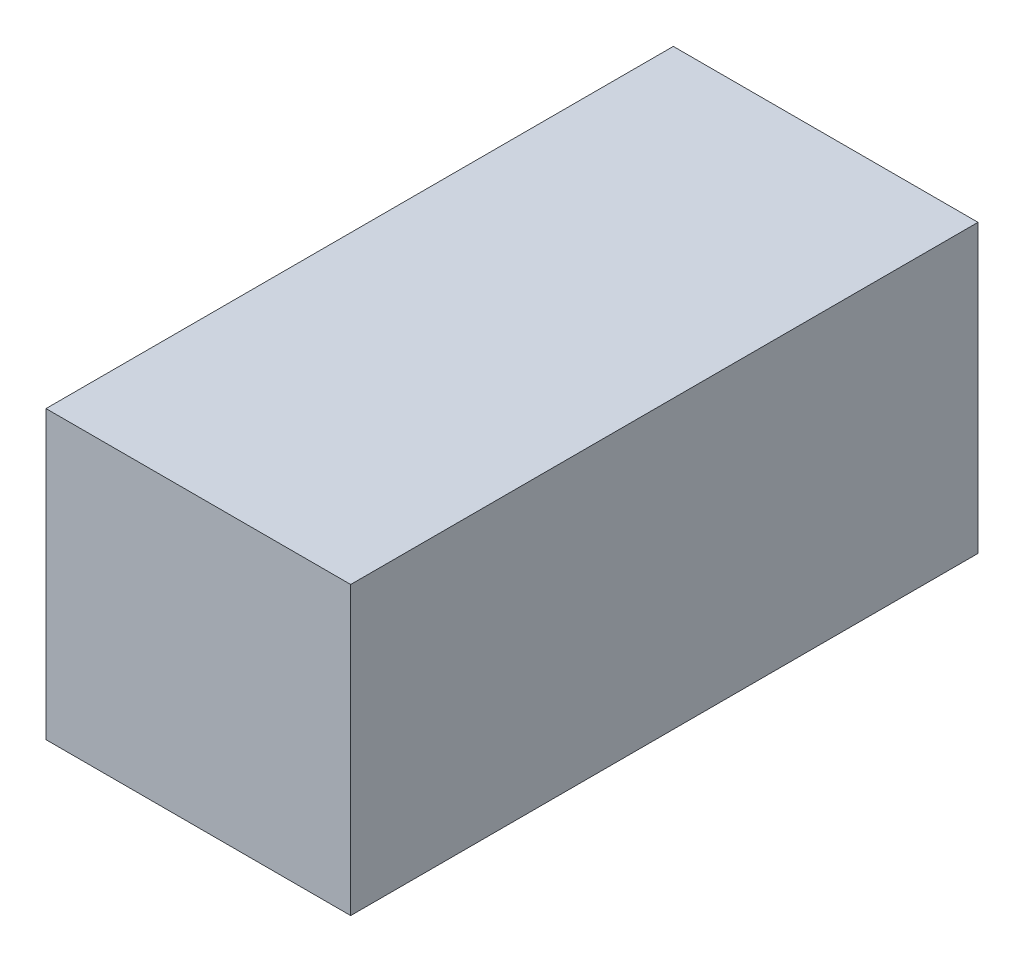
ISO-10303-21;
HEADER;
FILE_DESCRIPTION(('STEP AP214'),'2;1');
FILE_NAME('part.step','',(''),(''),'','','');
FILE_SCHEMA(('AUTOMOTIVE_DESIGN { 1 0 10303 214 1 1 1 1 }'));
ENDSEC;
DATA;
#1=APPLICATION_CONTEXT('core data for automotive mechanical design processes');
#2=APPLICATION_PROTOCOL_DEFINITION('international standard','automotive_design',2000,#1);
#3=PRODUCT_CONTEXT('',#1,'mechanical');
#4=PRODUCT('Part','Part','',(#3));
#5=PRODUCT_RELATED_PRODUCT_CATEGORY('part','',(#4));
#6=PRODUCT_DEFINITION_FORMATION('','',#4);
#7=PRODUCT_DEFINITION_CONTEXT('part definition',#1,'design');
#8=PRODUCT_DEFINITION('design','',#6,#7);
#9=PRODUCT_DEFINITION_SHAPE('','',#8);
#10=(LENGTH_UNIT() NAMED_UNIT(*) SI_UNIT(.MILLI.,.METRE.));
#11=(NAMED_UNIT(*) PLANE_ANGLE_UNIT() SI_UNIT($,.RADIAN.));
#12=(NAMED_UNIT(*) SI_UNIT($,.STERADIAN.) SOLID_ANGLE_UNIT());
#13=UNCERTAINTY_MEASURE_WITH_UNIT(LENGTH_MEASURE(1.E-05),#10,'distance_accuracy_value','');
#14=(GEOMETRIC_REPRESENTATION_CONTEXT(3) GLOBAL_UNCERTAINTY_ASSIGNED_CONTEXT((#13)) GLOBAL_UNIT_ASSIGNED_CONTEXT((#10,
#11,#12)) REPRESENTATION_CONTEXT('',''));
#15=CARTESIAN_POINT('',(0.,0.,0.));
#16=DIRECTION('',(0.,0.,1.));
#17=DIRECTION('',(1.,0.,0.));
#18=AXIS2_PLACEMENT_3D('',#15,#16,#17);
#19=CARTESIAN_POINT('',(14.8470188679246,8.128,-11.2383018867924));
#20=DIRECTION('',(1.,0.,0.));
#21=DIRECTION('',(0.,0.,-1.));
#22=AXIS2_PLACEMENT_3D('',#19,#20,#21);
#23=PLANE('',#22);
#24=DIRECTION('',(0.,0.,1.));
#25=VECTOR('',#24,1.);
#26=CARTESIAN_POINT('',(14.8470188679246,0.,-11.2383018867924));
#27=LINE('',#26,#25);
#28=CARTESIAN_POINT('',(14.8470188679246,0.,-11.2383018867924));
#29=VERTEX_POINT('',#28);
#30=CARTESIAN_POINT('',(14.8470188679246,0.,6.54169811320755));
#31=VERTEX_POINT('',#30);
#32=EDGE_CURVE('E104',#29,#31,#27,.T.);
#33=ORIENTED_EDGE('',*,*,#32,.T.);
#34=DIRECTION('',(0.,-1.,0.));
#35=VECTOR('',#34,1.);
#36=CARTESIAN_POINT('',(14.8470188679246,8.128,6.54169811320755));
#37=LINE('',#36,#35);
#38=CARTESIAN_POINT('',(14.8470188679246,8.128,6.54169811320755));
#39=VERTEX_POINT('',#38);
#40=EDGE_CURVE('E11',#39,#31,#37,.T.);
#41=ORIENTED_EDGE('',*,*,#40,.F.);
#42=DIRECTION('',(0.,0.,1.));
#43=VECTOR('',#42,1.);
#44=CARTESIAN_POINT('',(14.8470188679246,8.128,-11.2383018867924));
#45=LINE('',#44,#43);
#46=CARTESIAN_POINT('',(14.8470188679246,8.128,-11.2383018867924));
#47=VERTEX_POINT('',#46);
#48=EDGE_CURVE('E92',#47,#39,#45,.T.);
#49=ORIENTED_EDGE('',*,*,#48,.F.);
#50=DIRECTION('',(0.,-1.,0.));
#51=VECTOR('',#50,1.);
#52=CARTESIAN_POINT('',(14.8470188679246,8.128,-11.2383018867924));
#53=LINE('',#52,#51);
#54=EDGE_CURVE('E100',#47,#29,#53,.T.);
#55=ORIENTED_EDGE('',*,*,#54,.T.);
#56=EDGE_LOOP('',(#33,#41,#49,#55));
#57=FACE_BOUND('',#56,.T.);
#58=ADVANCED_FACE('F41',(#57),#23,.F.);
#59=CARTESIAN_POINT('',(14.8470188679246,8.128,6.54169811320755));
#60=DIRECTION('',(0.,0.,-1.));
#61=DIRECTION('',(-1.,0.,0.));
#62=AXIS2_PLACEMENT_3D('',#59,#60,#61);
#63=PLANE('',#62);
#64=DIRECTION('',(1.,0.,0.));
#65=VECTOR('',#64,1.);
#66=CARTESIAN_POINT('',(14.8470188679246,0.,6.54169811320755));
#67=LINE('',#66,#65);
#68=CARTESIAN_POINT('',(23.4830188679245,0.,6.54169811320756));
#69=VERTEX_POINT('',#68);
#70=EDGE_CURVE('E96',#31,#69,#67,.T.);
#71=ORIENTED_EDGE('',*,*,#70,.T.);
#72=DIRECTION('',(0.,-1.,0.));
#73=VECTOR('',#72,1.);
#74=CARTESIAN_POINT('',(23.4830188679245,8.128,6.54169811320756));
#75=LINE('',#74,#73);
#76=CARTESIAN_POINT('',(23.4830188679245,8.128,6.54169811320756));
#77=VERTEX_POINT('',#76);
#78=EDGE_CURVE('E49',#77,#69,#75,.T.);
#79=ORIENTED_EDGE('',*,*,#78,.F.);
#80=DIRECTION('',(1.,0.,0.));
#81=VECTOR('',#80,1.);
#82=CARTESIAN_POINT('',(14.8470188679246,8.128,6.54169811320755));
#83=LINE('',#82,#81);
#84=EDGE_CURVE('E87',#39,#77,#83,.T.);
#85=ORIENTED_EDGE('',*,*,#84,.F.);
#86=ORIENTED_EDGE('',*,*,#40,.T.);
#87=EDGE_LOOP('',(#71,#79,#85,#86));
#88=FACE_BOUND('',#87,.T.);
#89=ADVANCED_FACE('F95',(#88),#63,.F.);
#90=CARTESIAN_POINT('',(23.4830188679245,8.128,-11.2383018867924));
#91=DIRECTION('',(-1.,0.,0.));
#92=DIRECTION('',(0.,0.,1.));
#93=AXIS2_PLACEMENT_3D('',#90,#91,#92);
#94=PLANE('',#93);
#95=DIRECTION('',(0.,0.,-1.));
#96=VECTOR('',#95,1.);
#97=CARTESIAN_POINT('',(23.4830188679245,0.,-11.2383018867924));
#98=LINE('',#97,#96);
#99=CARTESIAN_POINT('',(23.4830188679245,0.,-11.2383018867924));
#100=VERTEX_POINT('',#99);
#101=EDGE_CURVE('E74',#69,#100,#98,.T.);
#102=ORIENTED_EDGE('',*,*,#101,.T.);
#103=DIRECTION('',(0.,-1.,0.));
#104=VECTOR('',#103,1.);
#105=CARTESIAN_POINT('',(23.4830188679245,8.128,-11.2383018867924));
#106=LINE('',#105,#104);
#107=CARTESIAN_POINT('',(23.4830188679245,8.128,-11.2383018867924));
#108=VERTEX_POINT('',#107);
#109=EDGE_CURVE('E97',#108,#100,#106,.T.);
#110=ORIENTED_EDGE('',*,*,#109,.F.);
#111=DIRECTION('',(0.,0.,-1.));
#112=VECTOR('',#111,1.);
#113=CARTESIAN_POINT('',(23.4830188679245,8.128,-11.2383018867924));
#114=LINE('',#113,#112);
#115=EDGE_CURVE('E90',#77,#108,#114,.T.);
#116=ORIENTED_EDGE('',*,*,#115,.F.);
#117=ORIENTED_EDGE('',*,*,#78,.T.);
#118=EDGE_LOOP('',(#102,#110,#116,#117));
#119=FACE_BOUND('',#118,.T.);
#120=ADVANCED_FACE('F98',(#119),#94,.F.);
#121=CARTESIAN_POINT('',(14.8470188679246,8.128,-11.2383018867924));
#122=DIRECTION('',(0.,0.,1.));
#123=DIRECTION('',(1.,0.,0.));
#124=AXIS2_PLACEMENT_3D('',#121,#122,#123);
#125=PLANE('',#124);
#126=DIRECTION('',(-1.,0.,0.));
#127=VECTOR('',#126,1.);
#128=CARTESIAN_POINT('',(14.8470188679246,0.,-11.2383018867924));
#129=LINE('',#128,#127);
#130=EDGE_CURVE('E80',#100,#29,#129,.T.);
#131=ORIENTED_EDGE('',*,*,#130,.T.);
#132=ORIENTED_EDGE('',*,*,#54,.F.);
#133=DIRECTION('',(-1.,0.,0.));
#134=VECTOR('',#133,1.);
#135=CARTESIAN_POINT('',(14.8470188679246,8.128,-11.2383018867924));
#136=LINE('',#135,#134);
#137=EDGE_CURVE('E57',#108,#47,#136,.T.);
#138=ORIENTED_EDGE('',*,*,#137,.F.);
#139=ORIENTED_EDGE('',*,*,#109,.T.);
#140=EDGE_LOOP('',(#131,#132,#138,#139));
#141=FACE_BOUND('',#140,.T.);
#142=ADVANCED_FACE('F111',(#141),#125,.F.);
#143=CARTESIAN_POINT('',(0.,8.128,0.));
#144=DIRECTION('',(0.,1.,0.));
#145=DIRECTION('',(0.,0.,1.));
#146=AXIS2_PLACEMENT_3D('',#143,#144,#145);
#147=PLANE('',#146);
#148=ORIENTED_EDGE('',*,*,#48,.T.);
#149=ORIENTED_EDGE('',*,*,#84,.T.);
#150=ORIENTED_EDGE('',*,*,#115,.T.);
#151=ORIENTED_EDGE('',*,*,#137,.T.);
#152=EDGE_LOOP('',(#148,#149,#150,#151));
#153=FACE_BOUND('',#152,.T.);
#154=ADVANCED_FACE('F88',(#153),#147,.T.);
#155=CARTESIAN_POINT('',(0.,0.,0.));
#156=DIRECTION('',(0.,1.,0.));
#157=DIRECTION('',(0.,0.,1.));
#158=AXIS2_PLACEMENT_3D('',#155,#156,#157);
#159=PLANE('',#158);
#160=ORIENTED_EDGE('',*,*,#32,.F.);
#161=ORIENTED_EDGE('',*,*,#130,.F.);
#162=ORIENTED_EDGE('',*,*,#101,.F.);
#163=ORIENTED_EDGE('',*,*,#70,.F.);
#164=EDGE_LOOP('',(#160,#161,#162,#163));
#165=FACE_BOUND('',#164,.T.);
#166=ADVANCED_FACE('F114',(#165),#159,.F.);
#167=CLOSED_SHELL('',(#58,#89,#120,#142,#154,#166));
#168=MANIFOLD_SOLID_BREP('B2',#167);
#169=ADVANCED_BREP_SHAPE_REPRESENTATION('',(#18,#168),#14);
#170=SHAPE_DEFINITION_REPRESENTATION(#9,#169);
ENDSEC;
END-ISO-10303-21;
